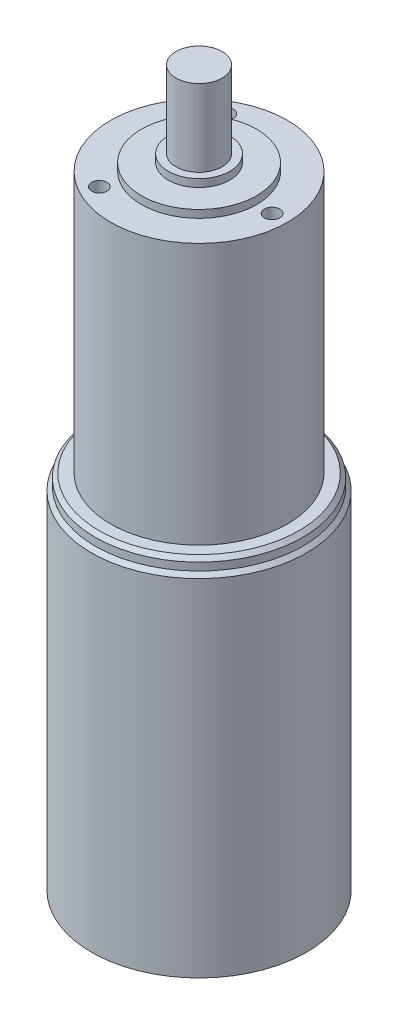
ISO-10303-21;
HEADER;
FILE_DESCRIPTION(('STEP AP214'),'2;1');
FILE_NAME('part.step','',(''),(''),'','','');
FILE_SCHEMA(('AUTOMOTIVE_DESIGN { 1 0 10303 214 1 1 1 1 }'));
ENDSEC;
DATA;
#1=APPLICATION_CONTEXT('core data for automotive mechanical design processes');
#2=APPLICATION_PROTOCOL_DEFINITION('international standard','automotive_design',2000,#1);
#3=PRODUCT_CONTEXT('',#1,'mechanical');
#4=PRODUCT('Part','Part','',(#3));
#5=PRODUCT_RELATED_PRODUCT_CATEGORY('part','',(#4));
#6=PRODUCT_DEFINITION_FORMATION('','',#4);
#7=PRODUCT_DEFINITION_CONTEXT('part definition',#1,'design');
#8=PRODUCT_DEFINITION('design','',#6,#7);
#9=PRODUCT_DEFINITION_SHAPE('','',#8);
#10=(LENGTH_UNIT() NAMED_UNIT(*) SI_UNIT(.MILLI.,.METRE.));
#11=(NAMED_UNIT(*) PLANE_ANGLE_UNIT() SI_UNIT($,.RADIAN.));
#12=(NAMED_UNIT(*) SI_UNIT($,.STERADIAN.) SOLID_ANGLE_UNIT());
#13=UNCERTAINTY_MEASURE_WITH_UNIT(LENGTH_MEASURE(1.E-05),#10,'distance_accuracy_value','');
#14=(GEOMETRIC_REPRESENTATION_CONTEXT(3) GLOBAL_UNCERTAINTY_ASSIGNED_CONTEXT((#13)) GLOBAL_UNIT_ASSIGNED_CONTEXT((#10,
#11,#12)) REPRESENTATION_CONTEXT('',''));
#15=CARTESIAN_POINT('',(0.,0.,0.));
#16=DIRECTION('',(0.,0.,1.));
#17=DIRECTION('',(1.,0.,0.));
#18=AXIS2_PLACEMENT_3D('',#15,#16,#17);
#19=CARTESIAN_POINT('',(0.,0.,0.));
#20=DIRECTION('',(0.,-1.,0.));
#21=DIRECTION('',(0.,0.,-1.));
#22=AXIS2_PLACEMENT_3D('',#19,#20,#21);
#23=PLANE('',#22);
#24=CARTESIAN_POINT('',(0.,0.,0.));
#25=DIRECTION('',(0.,-1.,0.));
#26=DIRECTION('',(0.,0.,-1.));
#27=AXIS2_PLACEMENT_3D('',#24,#25,#26);
#28=CIRCLE('',#27,14.);
#29=CARTESIAN_POINT('',(0.,0.,-14.));
#30=VERTEX_POINT('',#29);
#31=EDGE_CURVE('E10',#30,#30,#28,.T.);
#32=ORIENTED_EDGE('',*,*,#31,.T.);
#33=EDGE_LOOP('',(#32));
#34=FACE_BOUND('',#33,.T.);
#35=ADVANCED_FACE('F33',(#34),#23,.T.);
#36=CARTESIAN_POINT('',(0.,0.,0.));
#37=DIRECTION('',(0.,-1.,0.));
#38=DIRECTION('',(0.,0.,-1.));
#39=AXIS2_PLACEMENT_3D('',#36,#37,#38);
#40=CYLINDRICAL_SURFACE('',#39,14.);
#41=CARTESIAN_POINT('',(0.,45.,0.));
#42=DIRECTION('',(0.,-1.,0.));
#43=DIRECTION('',(0.,0.,-1.));
#44=AXIS2_PLACEMENT_3D('',#41,#42,#43);
#45=CIRCLE('',#44,14.);
#46=CARTESIAN_POINT('',(0.,45.,-14.));
#47=VERTEX_POINT('',#46);
#48=EDGE_CURVE('E39',#47,#47,#45,.T.);
#49=ORIENTED_EDGE('',*,*,#48,.T.);
#50=EDGE_LOOP('',(#49));
#51=FACE_BOUND('',#50,.T.);
#52=ORIENTED_EDGE('',*,*,#31,.F.);
#53=EDGE_LOOP('',(#52));
#54=FACE_BOUND('',#53,.T.);
#55=ADVANCED_FACE('F147',(#51,#54),#40,.T.);
#56=CARTESIAN_POINT('',(0.,45.,0.));
#57=DIRECTION('',(0.,-1.,0.));
#58=DIRECTION('',(0.,0.,-1.));
#59=AXIS2_PLACEMENT_3D('',#56,#57,#58);
#60=CONICAL_SURFACE('',#59,14.,0.785398163397448);
#61=CARTESIAN_POINT('',(0.,45.5,0.));
#62=DIRECTION('',(0.,-1.,0.));
#63=DIRECTION('',(0.,0.,-1.));
#64=AXIS2_PLACEMENT_3D('',#61,#62,#63);
#65=CIRCLE('',#64,13.5);
#66=CARTESIAN_POINT('',(0.,45.5,-13.5));
#67=VERTEX_POINT('',#66);
#68=EDGE_CURVE('E43',#67,#67,#65,.T.);
#69=ORIENTED_EDGE('',*,*,#68,.T.);
#70=EDGE_LOOP('',(#69));
#71=FACE_BOUND('',#70,.T.);
#72=ORIENTED_EDGE('',*,*,#48,.F.);
#73=EDGE_LOOP('',(#72));
#74=FACE_BOUND('',#73,.T.);
#75=ADVANCED_FACE('F141',(#71,#74),#60,.T.);
#76=CARTESIAN_POINT('',(0.,0.,0.));
#77=DIRECTION('',(0.,-1.,0.));
#78=DIRECTION('',(0.,0.,-1.));
#79=AXIS2_PLACEMENT_3D('',#76,#77,#78);
#80=CYLINDRICAL_SURFACE('',#79,13.5);
#81=CARTESIAN_POINT('',(0.,46.5,0.));
#82=DIRECTION('',(0.,-1.,0.));
#83=DIRECTION('',(0.,0.,-1.));
#84=AXIS2_PLACEMENT_3D('',#81,#82,#83);
#85=CIRCLE('',#84,13.5);
#86=CARTESIAN_POINT('',(0.,46.5,-13.5));
#87=VERTEX_POINT('',#86);
#88=EDGE_CURVE('E47',#87,#87,#85,.T.);
#89=ORIENTED_EDGE('',*,*,#88,.T.);
#90=EDGE_LOOP('',(#89));
#91=FACE_BOUND('',#90,.T.);
#92=ORIENTED_EDGE('',*,*,#68,.F.);
#93=EDGE_LOOP('',(#92));
#94=FACE_BOUND('',#93,.T.);
#95=ADVANCED_FACE('F135',(#91,#94),#80,.T.);
#96=CARTESIAN_POINT('',(0.,46.5,0.));
#97=DIRECTION('',(0.,-1.,0.));
#98=DIRECTION('',(0.,0.,-1.));
#99=AXIS2_PLACEMENT_3D('',#96,#97,#98);
#100=CONICAL_SURFACE('',#99,13.5,0.785398163397455);
#101=CARTESIAN_POINT('',(0.,47.,0.));
#102=DIRECTION('',(0.,-1.,0.));
#103=DIRECTION('',(0.,0.,-1.));
#104=AXIS2_PLACEMENT_3D('',#101,#102,#103);
#105=CIRCLE('',#104,13.);
#106=CARTESIAN_POINT('',(0.,47.,-13.));
#107=VERTEX_POINT('',#106);
#108=EDGE_CURVE('E52',#107,#107,#105,.T.);
#109=ORIENTED_EDGE('',*,*,#108,.T.);
#110=EDGE_LOOP('',(#109));
#111=FACE_BOUND('',#110,.T.);
#112=ORIENTED_EDGE('',*,*,#88,.F.);
#113=EDGE_LOOP('',(#112));
#114=FACE_BOUND('',#113,.T.);
#115=ADVANCED_FACE('F129',(#111,#114),#100,.T.);
#116=CARTESIAN_POINT('',(13.,47.,0.));
#117=DIRECTION('',(0.,1.,0.));
#118=DIRECTION('',(0.,0.,1.));
#119=AXIS2_PLACEMENT_3D('',#116,#117,#118);
#120=PLANE('',#119);
#121=CARTESIAN_POINT('',(0.,47.,0.));
#122=DIRECTION('',(0.,-1.,0.));
#123=DIRECTION('',(0.,0.,-1.));
#124=AXIS2_PLACEMENT_3D('',#121,#122,#123);
#125=CIRCLE('',#124,11.5);
#126=CARTESIAN_POINT('',(0.,47.,-11.5));
#127=VERTEX_POINT('',#126);
#128=EDGE_CURVE('E55',#127,#127,#125,.T.);
#129=ORIENTED_EDGE('',*,*,#128,.T.);
#130=EDGE_LOOP('',(#129));
#131=FACE_BOUND('',#130,.T.);
#132=ORIENTED_EDGE('',*,*,#108,.F.);
#133=EDGE_LOOP('',(#132));
#134=FACE_BOUND('',#133,.T.);
#135=ADVANCED_FACE('F123',(#131,#134),#120,.T.);
#136=CARTESIAN_POINT('',(0.,0.,0.));
#137=DIRECTION('',(0.,-1.,0.));
#138=DIRECTION('',(0.,0.,-1.));
#139=AXIS2_PLACEMENT_3D('',#136,#137,#138);
#140=CYLINDRICAL_SURFACE('',#139,11.5);
#141=CARTESIAN_POINT('',(0.,81.,0.));
#142=DIRECTION('',(0.,-1.,0.));
#143=DIRECTION('',(0.,0.,-1.));
#144=AXIS2_PLACEMENT_3D('',#141,#142,#143);
#145=CIRCLE('',#144,11.5);
#146=CARTESIAN_POINT('',(0.,81.,-11.5));
#147=VERTEX_POINT('',#146);
#148=EDGE_CURVE('E58',#147,#147,#145,.T.);
#149=ORIENTED_EDGE('',*,*,#148,.T.);
#150=EDGE_LOOP('',(#149));
#151=FACE_BOUND('',#150,.T.);
#152=ORIENTED_EDGE('',*,*,#128,.F.);
#153=EDGE_LOOP('',(#152));
#154=FACE_BOUND('',#153,.T.);
#155=ADVANCED_FACE('F111',(#151,#154),#140,.T.);
#156=CARTESIAN_POINT('',(11.5,81.,0.));
#157=DIRECTION('',(0.,1.,0.));
#158=DIRECTION('',(0.,0.,1.));
#159=AXIS2_PLACEMENT_3D('',#156,#157,#158);
#160=PLANE('',#159);
#161=CARTESIAN_POINT('',(-4.75000000000004,81.,-8.22724133595214));
#162=DIRECTION('',(0.,1.,0.));
#163=DIRECTION('',(0.,0.,1.));
#164=AXIS2_PLACEMENT_3D('',#161,#162,#163);
#165=CIRCLE('',#164,1.);
#166=CARTESIAN_POINT('',(-4.75000000000004,81.,-7.22724133595214));
#167=VERTEX_POINT('',#166);
#168=EDGE_CURVE('E92',#167,#167,#165,.T.);
#169=ORIENTED_EDGE('',*,*,#168,.F.);
#170=EDGE_LOOP('',(#169));
#171=FACE_BOUND('',#170,.T.);
#172=CARTESIAN_POINT('',(-4.75000000000004,81.,8.22724133595214));
#173=DIRECTION('',(0.,1.,0.));
#174=DIRECTION('',(0.,0.,1.));
#175=AXIS2_PLACEMENT_3D('',#172,#173,#174);
#176=CIRCLE('',#175,1.);
#177=CARTESIAN_POINT('',(-4.75000000000004,81.,9.22724133595215));
#178=VERTEX_POINT('',#177);
#179=EDGE_CURVE('E86',#178,#178,#176,.T.);
#180=ORIENTED_EDGE('',*,*,#179,.F.);
#181=EDGE_LOOP('',(#180));
#182=FACE_BOUND('',#181,.T.);
#183=CARTESIAN_POINT('',(9.5,81.,0.));
#184=DIRECTION('',(0.,1.,0.));
#185=DIRECTION('',(0.,0.,1.));
#186=AXIS2_PLACEMENT_3D('',#183,#184,#185);
#187=CIRCLE('',#186,1.);
#188=CARTESIAN_POINT('',(9.5,81.,1.));
#189=VERTEX_POINT('',#188);
#190=EDGE_CURVE('E80',#189,#189,#187,.T.);
#191=ORIENTED_EDGE('',*,*,#190,.F.);
#192=EDGE_LOOP('',(#191));
#193=FACE_BOUND('',#192,.T.);
#194=CARTESIAN_POINT('',(0.,81.,0.));
#195=DIRECTION('',(0.,-1.,0.));
#196=DIRECTION('',(0.,0.,-1.));
#197=AXIS2_PLACEMENT_3D('',#194,#195,#196);
#198=CIRCLE('',#197,7.5);
#199=CARTESIAN_POINT('',(0.,81.,-7.5));
#200=VERTEX_POINT('',#199);
#201=EDGE_CURVE('E61',#200,#200,#198,.T.);
#202=ORIENTED_EDGE('',*,*,#201,.T.);
#203=EDGE_LOOP('',(#202));
#204=FACE_BOUND('',#203,.T.);
#205=ORIENTED_EDGE('',*,*,#148,.F.);
#206=EDGE_LOOP('',(#205));
#207=FACE_BOUND('',#206,.T.);
#208=ADVANCED_FACE('F107',(#171,#182,#193,#204,#207),#160,.T.);
#209=CARTESIAN_POINT('',(0.,0.,0.));
#210=DIRECTION('',(0.,-1.,0.));
#211=DIRECTION('',(0.,0.,-1.));
#212=AXIS2_PLACEMENT_3D('',#209,#210,#211);
#213=CYLINDRICAL_SURFACE('',#212,7.5);
#214=CARTESIAN_POINT('',(0.,82.,0.));
#215=DIRECTION('',(0.,-1.,0.));
#216=DIRECTION('',(0.,0.,-1.));
#217=AXIS2_PLACEMENT_3D('',#214,#215,#216);
#218=CIRCLE('',#217,7.5);
#219=CARTESIAN_POINT('',(0.,82.,-7.5));
#220=VERTEX_POINT('',#219);
#221=EDGE_CURVE('E64',#220,#220,#218,.T.);
#222=ORIENTED_EDGE('',*,*,#221,.T.);
#223=EDGE_LOOP('',(#222));
#224=FACE_BOUND('',#223,.T.);
#225=ORIENTED_EDGE('',*,*,#201,.F.);
#226=EDGE_LOOP('',(#225));
#227=FACE_BOUND('',#226,.T.);
#228=ADVANCED_FACE('F110',(#224,#227),#213,.T.);
#229=CARTESIAN_POINT('',(7.5,82.,0.));
#230=DIRECTION('',(0.,1.,0.));
#231=DIRECTION('',(0.,0.,1.));
#232=AXIS2_PLACEMENT_3D('',#229,#230,#231);
#233=PLANE('',#232);
#234=CARTESIAN_POINT('',(0.,82.,0.));
#235=DIRECTION('',(0.,-1.,0.));
#236=DIRECTION('',(0.,0.,-1.));
#237=AXIS2_PLACEMENT_3D('',#234,#235,#236);
#238=CIRCLE('',#237,4.);
#239=CARTESIAN_POINT('',(0.,82.,-4.));
#240=VERTEX_POINT('',#239);
#241=EDGE_CURVE('E67',#240,#240,#238,.T.);
#242=ORIENTED_EDGE('',*,*,#241,.T.);
#243=EDGE_LOOP('',(#242));
#244=FACE_BOUND('',#243,.T.);
#245=ORIENTED_EDGE('',*,*,#221,.F.);
#246=EDGE_LOOP('',(#245));
#247=FACE_BOUND('',#246,.T.);
#248=ADVANCED_FACE('F199',(#244,#247),#233,.T.);
#249=CARTESIAN_POINT('',(0.,0.,0.));
#250=DIRECTION('',(0.,-1.,0.));
#251=DIRECTION('',(0.,0.,-1.));
#252=AXIS2_PLACEMENT_3D('',#249,#250,#251);
#253=CYLINDRICAL_SURFACE('',#252,4.);
#254=CARTESIAN_POINT('',(0.,83.,0.));
#255=DIRECTION('',(0.,-1.,0.));
#256=DIRECTION('',(0.,0.,-1.));
#257=AXIS2_PLACEMENT_3D('',#254,#255,#256);
#258=CIRCLE('',#257,4.);
#259=CARTESIAN_POINT('',(0.,83.,-4.));
#260=VERTEX_POINT('',#259);
#261=EDGE_CURVE('E70',#260,#260,#258,.T.);
#262=ORIENTED_EDGE('',*,*,#261,.T.);
#263=EDGE_LOOP('',(#262));
#264=FACE_BOUND('',#263,.T.);
#265=ORIENTED_EDGE('',*,*,#241,.F.);
#266=EDGE_LOOP('',(#265));
#267=FACE_BOUND('',#266,.T.);
#268=ADVANCED_FACE('F209',(#264,#267),#253,.T.);
#269=CARTESIAN_POINT('',(4.,83.,0.));
#270=DIRECTION('',(0.,1.,0.));
#271=DIRECTION('',(0.,0.,1.));
#272=AXIS2_PLACEMENT_3D('',#269,#270,#271);
#273=PLANE('',#272);
#274=CARTESIAN_POINT('',(0.,83.,0.));
#275=DIRECTION('',(0.,-1.,0.));
#276=DIRECTION('',(0.,0.,-1.));
#277=AXIS2_PLACEMENT_3D('',#274,#275,#276);
#278=CIRCLE('',#277,3.);
#279=CARTESIAN_POINT('',(0.,83.,-3.));
#280=VERTEX_POINT('',#279);
#281=EDGE_CURVE('E73',#280,#280,#278,.T.);
#282=ORIENTED_EDGE('',*,*,#281,.T.);
#283=EDGE_LOOP('',(#282));
#284=FACE_BOUND('',#283,.T.);
#285=ORIENTED_EDGE('',*,*,#261,.F.);
#286=EDGE_LOOP('',(#285));
#287=FACE_BOUND('',#286,.T.);
#288=ADVANCED_FACE('F219',(#284,#287),#273,.T.);
#289=CARTESIAN_POINT('',(0.,0.,0.));
#290=DIRECTION('',(0.,-1.,0.));
#291=DIRECTION('',(0.,0.,-1.));
#292=AXIS2_PLACEMENT_3D('',#289,#290,#291);
#293=CYLINDRICAL_SURFACE('',#292,3.);
#294=CARTESIAN_POINT('',(0.,93.,0.));
#295=DIRECTION('',(0.,-1.,0.));
#296=DIRECTION('',(0.,0.,-1.));
#297=AXIS2_PLACEMENT_3D('',#294,#295,#296);
#298=CIRCLE('',#297,3.);
#299=CARTESIAN_POINT('',(0.,93.,-3.));
#300=VERTEX_POINT('',#299);
#301=EDGE_CURVE('E76',#300,#300,#298,.T.);
#302=ORIENTED_EDGE('',*,*,#301,.T.);
#303=EDGE_LOOP('',(#302));
#304=FACE_BOUND('',#303,.T.);
#305=ORIENTED_EDGE('',*,*,#281,.F.);
#306=EDGE_LOOP('',(#305));
#307=FACE_BOUND('',#306,.T.);
#308=ADVANCED_FACE('F229',(#304,#307),#293,.T.);
#309=CARTESIAN_POINT('',(3.,93.,0.));
#310=DIRECTION('',(0.,1.,0.));
#311=DIRECTION('',(0.,0.,1.));
#312=AXIS2_PLACEMENT_3D('',#309,#310,#311);
#313=PLANE('',#312);
#314=ORIENTED_EDGE('',*,*,#301,.F.);
#315=EDGE_LOOP('',(#314));
#316=FACE_BOUND('',#315,.T.);
#317=ADVANCED_FACE('F239',(#316),#313,.T.);
#318=CARTESIAN_POINT('',(9.5,76.,0.));
#319=DIRECTION('',(0.,1.,0.));
#320=DIRECTION('',(0.,0.,1.));
#321=AXIS2_PLACEMENT_3D('',#318,#319,#320);
#322=CYLINDRICAL_SURFACE('',#321,1.);
#323=CARTESIAN_POINT('',(9.5,76.,0.));
#324=DIRECTION('',(0.,1.,0.));
#325=DIRECTION('',(0.,0.,1.));
#326=AXIS2_PLACEMENT_3D('',#323,#324,#325);
#327=CIRCLE('',#326,1.);
#328=CARTESIAN_POINT('',(9.5,76.,1.));
#329=VERTEX_POINT('',#328);
#330=EDGE_CURVE('E79',#329,#329,#327,.T.);
#331=ORIENTED_EDGE('',*,*,#330,.F.);
#332=EDGE_LOOP('',(#331));
#333=FACE_BOUND('',#332,.T.);
#334=ORIENTED_EDGE('',*,*,#190,.T.);
#335=EDGE_LOOP('',(#334));
#336=FACE_BOUND('',#335,.T.);
#337=ADVANCED_FACE('F249',(#333,#336),#322,.F.);
#338=CARTESIAN_POINT('',(9.5,76.,0.));
#339=DIRECTION('',(0.,1.,0.));
#340=DIRECTION('',(0.,0.,1.));
#341=AXIS2_PLACEMENT_3D('',#338,#339,#340);
#342=PLANE('',#341);
#343=ORIENTED_EDGE('',*,*,#330,.T.);
#344=EDGE_LOOP('',(#343));
#345=FACE_BOUND('',#344,.T.);
#346=ADVANCED_FACE('F264',(#345),#342,.T.);
#347=CARTESIAN_POINT('',(-4.75000000000004,76.,8.22724133595214));
#348=DIRECTION('',(0.,1.,0.));
#349=DIRECTION('',(0.,0.,1.));
#350=AXIS2_PLACEMENT_3D('',#347,#348,#349);
#351=CYLINDRICAL_SURFACE('',#350,1.);
#352=CARTESIAN_POINT('',(-4.75000000000004,76.,8.22724133595214));
#353=DIRECTION('',(0.,1.,0.));
#354=DIRECTION('',(0.,0.,1.));
#355=AXIS2_PLACEMENT_3D('',#352,#353,#354);
#356=CIRCLE('',#355,1.);
#357=CARTESIAN_POINT('',(-4.75000000000004,76.,9.22724133595215));
#358=VERTEX_POINT('',#357);
#359=EDGE_CURVE('E83',#358,#358,#356,.T.);
#360=ORIENTED_EDGE('',*,*,#359,.F.);
#361=EDGE_LOOP('',(#360));
#362=FACE_BOUND('',#361,.T.);
#363=ORIENTED_EDGE('',*,*,#179,.T.);
#364=EDGE_LOOP('',(#363));
#365=FACE_BOUND('',#364,.T.);
#366=ADVANCED_FACE('F274',(#362,#365),#351,.F.);
#367=CARTESIAN_POINT('',(-4.75000000000004,76.,8.22724133595214));
#368=DIRECTION('',(0.,1.,0.));
#369=DIRECTION('',(0.,0.,1.));
#370=AXIS2_PLACEMENT_3D('',#367,#368,#369);
#371=PLANE('',#370);
#372=ORIENTED_EDGE('',*,*,#359,.T.);
#373=EDGE_LOOP('',(#372));
#374=FACE_BOUND('',#373,.T.);
#375=ADVANCED_FACE('F103',(#374),#371,.T.);
#376=CARTESIAN_POINT('',(-4.75000000000004,76.,-8.22724133595214));
#377=DIRECTION('',(0.,1.,0.));
#378=DIRECTION('',(0.,0.,1.));
#379=AXIS2_PLACEMENT_3D('',#376,#377,#378);
#380=CYLINDRICAL_SURFACE('',#379,1.);
#381=CARTESIAN_POINT('',(-4.75000000000004,76.,-8.22724133595214));
#382=DIRECTION('',(0.,1.,0.));
#383=DIRECTION('',(0.,0.,1.));
#384=AXIS2_PLACEMENT_3D('',#381,#382,#383);
#385=CIRCLE('',#384,1.);
#386=CARTESIAN_POINT('',(-4.75000000000004,76.,-7.22724133595214));
#387=VERTEX_POINT('',#386);
#388=EDGE_CURVE('E89',#387,#387,#385,.T.);
#389=ORIENTED_EDGE('',*,*,#388,.F.);
#390=EDGE_LOOP('',(#389));
#391=FACE_BOUND('',#390,.T.);
#392=ORIENTED_EDGE('',*,*,#168,.T.);
#393=EDGE_LOOP('',(#392));
#394=FACE_BOUND('',#393,.T.);
#395=ADVANCED_FACE('F100',(#391,#394),#380,.F.);
#396=CARTESIAN_POINT('',(-4.75000000000004,76.,-8.22724133595214));
#397=DIRECTION('',(0.,1.,0.));
#398=DIRECTION('',(0.,0.,1.));
#399=AXIS2_PLACEMENT_3D('',#396,#397,#398);
#400=PLANE('',#399);
#401=ORIENTED_EDGE('',*,*,#388,.T.);
#402=EDGE_LOOP('',(#401));
#403=FACE_BOUND('',#402,.T.);
#404=ADVANCED_FACE('F98',(#403),#400,.T.);
#405=CLOSED_SHELL('',(#35,#55,#75,#95,#115,#135,#155,#208,#228,#248,#268,#288,#308,#317,#337,
#346,#366,#375,#395,#404));
#406=MANIFOLD_SOLID_BREP('B2',#405);
#407=ADVANCED_BREP_SHAPE_REPRESENTATION('',(#18,#406),#14);
#408=SHAPE_DEFINITION_REPRESENTATION(#9,#407);
ENDSEC;
END-ISO-10303-21;
